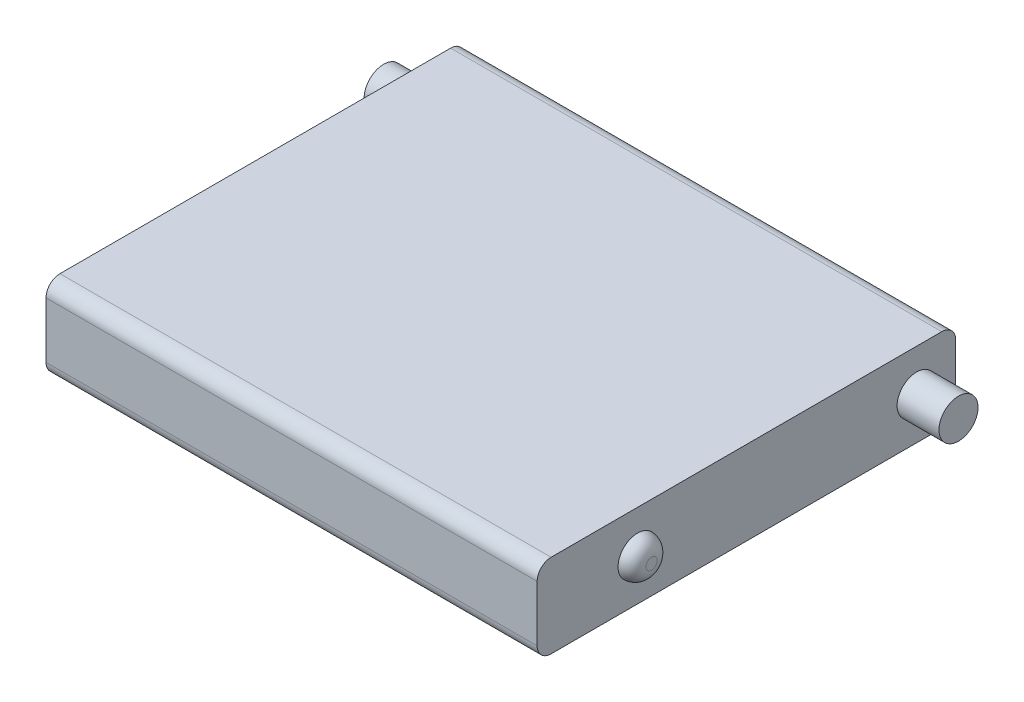
ISO-10303-21;
HEADER;
FILE_DESCRIPTION(('STEP AP214'),'2;1');
FILE_NAME('part.step','',(''),(''),'','','');
FILE_SCHEMA(('AUTOMOTIVE_DESIGN { 1 0 10303 214 1 1 1 1 }'));
ENDSEC;
DATA;
#1=APPLICATION_CONTEXT('core data for automotive mechanical design processes');
#2=APPLICATION_PROTOCOL_DEFINITION('international standard','automotive_design',2000,#1);
#3=PRODUCT_CONTEXT('',#1,'mechanical');
#4=PRODUCT('Part','Part','',(#3));
#5=PRODUCT_RELATED_PRODUCT_CATEGORY('part','',(#4));
#6=PRODUCT_DEFINITION_FORMATION('','',#4);
#7=PRODUCT_DEFINITION_CONTEXT('part definition',#1,'design');
#8=PRODUCT_DEFINITION('design','',#6,#7);
#9=PRODUCT_DEFINITION_SHAPE('','',#8);
#10=(LENGTH_UNIT() NAMED_UNIT(*) SI_UNIT(.MILLI.,.METRE.));
#11=(NAMED_UNIT(*) PLANE_ANGLE_UNIT() SI_UNIT($,.RADIAN.));
#12=(NAMED_UNIT(*) SI_UNIT($,.STERADIAN.) SOLID_ANGLE_UNIT());
#13=UNCERTAINTY_MEASURE_WITH_UNIT(LENGTH_MEASURE(1.E-05),#10,'distance_accuracy_value','');
#14=(GEOMETRIC_REPRESENTATION_CONTEXT(3) GLOBAL_UNCERTAINTY_ASSIGNED_CONTEXT((#13)) GLOBAL_UNIT_ASSIGNED_CONTEXT((#10,
#11,#12)) REPRESENTATION_CONTEXT('',''));
#15=CARTESIAN_POINT('',(0.,0.,0.));
#16=DIRECTION('',(0.,0.,1.));
#17=DIRECTION('',(1.,0.,0.));
#18=AXIS2_PLACEMENT_3D('',#15,#16,#17);
#19=CARTESIAN_POINT('',(8.80000000000001,1.5,-7.50000000000001));
#20=DIRECTION('',(-1.,0.,0.));
#21=DIRECTION('',(0.,0.,1.));
#22=AXIS2_PLACEMENT_3D('',#19,#20,#21);
#23=PLANE('',#22);
#24=CARTESIAN_POINT('',(8.8,0.,3.9));
#25=DIRECTION('',(-1.,0.,0.));
#26=DIRECTION('',(0.,0.,1.));
#27=AXIS2_PLACEMENT_3D('',#24,#25,#26);
#28=CIRCLE('',#27,0.700000000000002);
#29=CARTESIAN_POINT('',(8.8,0.,4.6));
#30=VERTEX_POINT('',#29);
#31=EDGE_CURVE('E485',#30,#30,#28,.T.);
#32=ORIENTED_EDGE('',*,*,#31,.T.);
#33=EDGE_LOOP('',(#32));
#34=FACE_BOUND('',#33,.T.);
#35=CARTESIAN_POINT('',(8.8,0.,-6.1));
#36=DIRECTION('',(-1.,0.,0.));
#37=DIRECTION('',(0.,0.,1.));
#38=AXIS2_PLACEMENT_3D('',#35,#36,#37);
#39=CIRCLE('',#38,0.700000000000002);
#40=CARTESIAN_POINT('',(8.8,0.,-5.4));
#41=VERTEX_POINT('',#40);
#42=EDGE_CURVE('E481',#41,#41,#39,.T.);
#43=ORIENTED_EDGE('',*,*,#42,.T.);
#44=EDGE_LOOP('',(#43));
#45=FACE_BOUND('',#44,.T.);
#46=DIRECTION('',(0.,0.,-1.));
#47=VECTOR('',#46,1.);
#48=CARTESIAN_POINT('',(8.80000000000001,-1.5,-7.50000000000001));
#49=LINE('',#48,#47);
#50=CARTESIAN_POINT('',(8.80000000000001,-1.5,6.99999999999999));
#51=VERTEX_POINT('',#50);
#52=CARTESIAN_POINT('',(8.80000000000001,-1.5,-7.00000000000001));
#53=VERTEX_POINT('',#52);
#54=EDGE_CURVE('E164',#51,#53,#49,.T.);
#55=ORIENTED_EDGE('',*,*,#54,.T.);
#56=CARTESIAN_POINT('',(8.80000000000001,-1.,-7.00000000000001));
#57=DIRECTION('',(-1.,0.,0.));
#58=DIRECTION('',(0.,0.,1.));
#59=AXIS2_PLACEMENT_3D('',#56,#57,#58);
#60=CIRCLE('',#59,0.5);
#61=CARTESIAN_POINT('',(8.80000000000001,-1.,-7.50000000000001));
#62=VERTEX_POINT('',#61);
#63=EDGE_CURVE('E223',#53,#62,#60,.F.);
#64=ORIENTED_EDGE('',*,*,#63,.T.);
#65=DIRECTION('',(0.,-1.,0.));
#66=VECTOR('',#65,1.);
#67=CARTESIAN_POINT('',(8.80000000000001,1.5,-7.50000000000001));
#68=LINE('',#67,#66);
#69=CARTESIAN_POINT('',(8.80000000000001,1.,-7.50000000000001));
#70=VERTEX_POINT('',#69);
#71=EDGE_CURVE('E187',#70,#62,#68,.T.);
#72=ORIENTED_EDGE('',*,*,#71,.F.);
#73=CARTESIAN_POINT('',(8.80000000000001,1.,-7.00000000000001));
#74=DIRECTION('',(-1.,0.,0.));
#75=DIRECTION('',(0.,0.,1.));
#76=AXIS2_PLACEMENT_3D('',#73,#74,#75);
#77=CIRCLE('',#76,0.5);
#78=CARTESIAN_POINT('',(8.80000000000001,1.5,-7.00000000000001));
#79=VERTEX_POINT('',#78);
#80=EDGE_CURVE('E221',#70,#79,#77,.F.);
#81=ORIENTED_EDGE('',*,*,#80,.T.);
#82=DIRECTION('',(0.,0.,-1.));
#83=VECTOR('',#82,1.);
#84=CARTESIAN_POINT('',(8.80000000000001,1.5,-7.50000000000001));
#85=LINE('',#84,#83);
#86=CARTESIAN_POINT('',(8.80000000000001,1.5,6.99999999999999));
#87=VERTEX_POINT('',#86);
#88=EDGE_CURVE('E168',#87,#79,#85,.T.);
#89=ORIENTED_EDGE('',*,*,#88,.F.);
#90=CARTESIAN_POINT('',(8.80000000000001,1.,6.99999999999999));
#91=DIRECTION('',(-1.,0.,0.));
#92=DIRECTION('',(0.,0.,1.));
#93=AXIS2_PLACEMENT_3D('',#90,#91,#92);
#94=CIRCLE('',#93,0.5);
#95=CARTESIAN_POINT('',(8.80000000000001,1.,7.49999999999999));
#96=VERTEX_POINT('',#95);
#97=EDGE_CURVE('E54',#87,#96,#94,.F.);
#98=ORIENTED_EDGE('',*,*,#97,.T.);
#99=DIRECTION('',(0.,-1.,0.));
#100=VECTOR('',#99,1.);
#101=CARTESIAN_POINT('',(8.80000000000001,1.5,7.49999999999999));
#102=LINE('',#101,#100);
#103=CARTESIAN_POINT('',(8.80000000000001,-1.,7.49999999999999));
#104=VERTEX_POINT('',#103);
#105=EDGE_CURVE('E175',#96,#104,#102,.T.);
#106=ORIENTED_EDGE('',*,*,#105,.T.);
#107=CARTESIAN_POINT('',(8.80000000000001,-1.,6.99999999999999));
#108=DIRECTION('',(-1.,0.,0.));
#109=DIRECTION('',(0.,0.,1.));
#110=AXIS2_PLACEMENT_3D('',#107,#108,#109);
#111=CIRCLE('',#110,0.5);
#112=EDGE_CURVE('E47',#104,#51,#111,.F.);
#113=ORIENTED_EDGE('',*,*,#112,.T.);
#114=EDGE_LOOP('',(#55,#64,#72,#81,#89,#98,#106,#113));
#115=FACE_BOUND('',#114,.T.);
#116=ADVANCED_FACE('F32',(#34,#45,#115),#23,.F.);
#117=CARTESIAN_POINT('',(-8.8,1.5,-7.50000000000001));
#118=DIRECTION('',(0.,0.,1.));
#119=DIRECTION('',(1.,0.,0.));
#120=AXIS2_PLACEMENT_3D('',#117,#118,#119);
#121=PLANE('',#120);
#122=ORIENTED_EDGE('',*,*,#71,.T.);
#123=DIRECTION('',(-1.,0.,0.));
#124=VECTOR('',#123,1.);
#125=CARTESIAN_POINT('',(-8.8,-1.,-7.50000000000001));
#126=LINE('',#125,#124);
#127=CARTESIAN_POINT('',(-8.8,-1.,-7.50000000000001));
#128=VERTEX_POINT('',#127);
#129=EDGE_CURVE('E204',#62,#128,#126,.T.);
#130=ORIENTED_EDGE('',*,*,#129,.T.);
#131=DIRECTION('',(0.,-1.,0.));
#132=VECTOR('',#131,1.);
#133=CARTESIAN_POINT('',(-8.8,1.5,-7.50000000000001));
#134=LINE('',#133,#132);
#135=CARTESIAN_POINT('',(-8.8,1.,-7.50000000000001));
#136=VERTEX_POINT('',#135);
#137=EDGE_CURVE('E184',#136,#128,#134,.T.);
#138=ORIENTED_EDGE('',*,*,#137,.F.);
#139=DIRECTION('',(-1.,0.,0.));
#140=VECTOR('',#139,1.);
#141=CARTESIAN_POINT('',(8.80000000000001,1.,-7.50000000000001));
#142=LINE('',#141,#140);
#143=EDGE_CURVE('E202',#136,#70,#142,.F.);
#144=ORIENTED_EDGE('',*,*,#143,.T.);
#145=EDGE_LOOP('',(#122,#130,#138,#144));
#146=FACE_BOUND('',#145,.T.);
#147=ADVANCED_FACE('F251',(#146),#121,.F.);
#148=CARTESIAN_POINT('',(-8.8,1.5,-7.50000000000001));
#149=DIRECTION('',(1.,0.,0.));
#150=DIRECTION('',(0.,0.,-1.));
#151=AXIS2_PLACEMENT_3D('',#148,#149,#150);
#152=PLANE('',#151);
#153=CARTESIAN_POINT('',(-8.8,0.,3.9));
#154=DIRECTION('',(1.,0.,0.));
#155=DIRECTION('',(0.,0.,-1.));
#156=AXIS2_PLACEMENT_3D('',#153,#154,#155);
#157=CIRCLE('',#156,0.700000000000002);
#158=CARTESIAN_POINT('',(-8.8,0.,3.2));
#159=VERTEX_POINT('',#158);
#160=EDGE_CURVE('E193',#159,#159,#157,.F.);
#161=ORIENTED_EDGE('',*,*,#160,.F.);
#162=EDGE_LOOP('',(#161));
#163=FACE_BOUND('',#162,.T.);
#164=CARTESIAN_POINT('',(-8.8,0.,-6.1));
#165=DIRECTION('',(1.,0.,0.));
#166=DIRECTION('',(0.,0.,-1.));
#167=AXIS2_PLACEMENT_3D('',#164,#165,#166);
#168=CIRCLE('',#167,0.700000000000002);
#169=CARTESIAN_POINT('',(-8.8,0.,-6.8));
#170=VERTEX_POINT('',#169);
#171=EDGE_CURVE('E190',#170,#170,#168,.F.);
#172=ORIENTED_EDGE('',*,*,#171,.F.);
#173=EDGE_LOOP('',(#172));
#174=FACE_BOUND('',#173,.T.);
#175=ORIENTED_EDGE('',*,*,#137,.T.);
#176=CARTESIAN_POINT('',(-8.8,-1.,-7.00000000000001));
#177=DIRECTION('',(1.,0.,0.));
#178=DIRECTION('',(0.,0.,-1.));
#179=AXIS2_PLACEMENT_3D('',#176,#177,#178);
#180=CIRCLE('',#179,0.5);
#181=CARTESIAN_POINT('',(-8.8,-1.5,-7.00000000000001));
#182=VERTEX_POINT('',#181);
#183=EDGE_CURVE('E213',#128,#182,#180,.F.);
#184=ORIENTED_EDGE('',*,*,#183,.T.);
#185=DIRECTION('',(0.,0.,1.));
#186=VECTOR('',#185,1.);
#187=CARTESIAN_POINT('',(-8.8,-1.5,-7.50000000000001));
#188=LINE('',#187,#186);
#189=CARTESIAN_POINT('',(-8.8,-1.5,6.99999999999999));
#190=VERTEX_POINT('',#189);
#191=EDGE_CURVE('E172',#182,#190,#188,.T.);
#192=ORIENTED_EDGE('',*,*,#191,.T.);
#193=CARTESIAN_POINT('',(-8.8,-1.,6.99999999999999));
#194=DIRECTION('',(1.,0.,0.));
#195=DIRECTION('',(0.,0.,-1.));
#196=AXIS2_PLACEMENT_3D('',#193,#194,#195);
#197=CIRCLE('',#196,0.5);
#198=CARTESIAN_POINT('',(-8.8,-1.,7.49999999999999));
#199=VERTEX_POINT('',#198);
#200=EDGE_CURVE('E209',#190,#199,#197,.F.);
#201=ORIENTED_EDGE('',*,*,#200,.T.);
#202=DIRECTION('',(0.,-1.,0.));
#203=VECTOR('',#202,1.);
#204=CARTESIAN_POINT('',(-8.8,1.5,7.49999999999999));
#205=LINE('',#204,#203);
#206=CARTESIAN_POINT('',(-8.8,1.,7.49999999999999));
#207=VERTEX_POINT('',#206);
#208=EDGE_CURVE('E181',#207,#199,#205,.T.);
#209=ORIENTED_EDGE('',*,*,#208,.F.);
#210=CARTESIAN_POINT('',(-8.8,1.,6.99999999999999));
#211=DIRECTION('',(1.,0.,0.));
#212=DIRECTION('',(0.,0.,-1.));
#213=AXIS2_PLACEMENT_3D('',#210,#211,#212);
#214=CIRCLE('',#213,0.5);
#215=CARTESIAN_POINT('',(-8.8,1.5,6.99999999999999));
#216=VERTEX_POINT('',#215);
#217=EDGE_CURVE('E207',#207,#216,#214,.F.);
#218=ORIENTED_EDGE('',*,*,#217,.T.);
#219=DIRECTION('',(0.,0.,1.));
#220=VECTOR('',#219,1.);
#221=CARTESIAN_POINT('',(-8.8,1.5,-7.50000000000001));
#222=LINE('',#221,#220);
#223=CARTESIAN_POINT('',(-8.8,1.5,-7.00000000000001));
#224=VERTEX_POINT('',#223);
#225=EDGE_CURVE('E171',#224,#216,#222,.T.);
#226=ORIENTED_EDGE('',*,*,#225,.F.);
#227=CARTESIAN_POINT('',(-8.8,1.,-7.00000000000001));
#228=DIRECTION('',(1.,0.,0.));
#229=DIRECTION('',(0.,0.,-1.));
#230=AXIS2_PLACEMENT_3D('',#227,#228,#229);
#231=CIRCLE('',#230,0.5);
#232=EDGE_CURVE('E211',#224,#136,#231,.F.);
#233=ORIENTED_EDGE('',*,*,#232,.T.);
#234=EDGE_LOOP('',(#175,#184,#192,#201,#209,#218,#226,#233));
#235=FACE_BOUND('',#234,.T.);
#236=ADVANCED_FACE('F237',(#163,#174,#235),#152,.F.);
#237=CARTESIAN_POINT('',(-8.8,1.5,7.49999999999999));
#238=DIRECTION('',(0.,0.,-1.));
#239=DIRECTION('',(-1.,0.,0.));
#240=AXIS2_PLACEMENT_3D('',#237,#238,#239);
#241=PLANE('',#240);
#242=ORIENTED_EDGE('',*,*,#208,.T.);
#243=DIRECTION('',(1.,0.,0.));
#244=VECTOR('',#243,1.);
#245=CARTESIAN_POINT('',(-8.8,-1.,7.49999999999999));
#246=LINE('',#245,#244);
#247=EDGE_CURVE('E11',#199,#104,#246,.T.);
#248=ORIENTED_EDGE('',*,*,#247,.T.);
#249=ORIENTED_EDGE('',*,*,#105,.F.);
#250=DIRECTION('',(1.,0.,0.));
#251=VECTOR('',#250,1.);
#252=CARTESIAN_POINT('',(-8.8,1.,7.49999999999999));
#253=LINE('',#252,#251);
#254=EDGE_CURVE('E40',#96,#207,#253,.F.);
#255=ORIENTED_EDGE('',*,*,#254,.T.);
#256=EDGE_LOOP('',(#242,#248,#249,#255));
#257=FACE_BOUND('',#256,.T.);
#258=ADVANCED_FACE('F233',(#257),#241,.F.);
#259=CARTESIAN_POINT('',(0.,1.5,0.));
#260=DIRECTION('',(0.,1.,0.));
#261=DIRECTION('',(0.,0.,1.));
#262=AXIS2_PLACEMENT_3D('',#259,#260,#261);
#263=PLANE('',#262);
#264=ORIENTED_EDGE('',*,*,#88,.T.);
#265=DIRECTION('',(-1.,0.,0.));
#266=VECTOR('',#265,1.);
#267=CARTESIAN_POINT('',(-8.8,1.5,-7.00000000000001));
#268=LINE('',#267,#266);
#269=EDGE_CURVE('E228',#79,#224,#268,.T.);
#270=ORIENTED_EDGE('',*,*,#269,.T.);
#271=ORIENTED_EDGE('',*,*,#225,.T.);
#272=DIRECTION('',(1.,0.,0.));
#273=VECTOR('',#272,1.);
#274=CARTESIAN_POINT('',(8.80000000000001,1.5,6.99999999999999));
#275=LINE('',#274,#273);
#276=EDGE_CURVE('E225',#216,#87,#275,.T.);
#277=ORIENTED_EDGE('',*,*,#276,.T.);
#278=EDGE_LOOP('',(#264,#270,#271,#277));
#279=FACE_BOUND('',#278,.T.);
#280=ADVANCED_FACE('F242',(#279),#263,.T.);
#281=CARTESIAN_POINT('',(0.,-1.5,0.));
#282=DIRECTION('',(0.,1.,0.));
#283=DIRECTION('',(0.,0.,1.));
#284=AXIS2_PLACEMENT_3D('',#281,#282,#283);
#285=PLANE('',#284);
#286=DIRECTION('',(-1.,0.,0.));
#287=VECTOR('',#286,1.);
#288=CARTESIAN_POINT('',(-7.4,-1.5,4.99999999999999));
#289=LINE('',#288,#287);
#290=CARTESIAN_POINT('',(7.40000000000001,-1.5,4.99999999999999));
#291=VERTEX_POINT('',#290);
#292=CARTESIAN_POINT('',(-7.4,-1.5,4.99999999999999));
#293=VERTEX_POINT('',#292);
#294=EDGE_CURVE('E158',#291,#293,#289,.T.);
#295=ORIENTED_EDGE('',*,*,#294,.F.);
#296=DIRECTION('',(0.,0.,1.));
#297=VECTOR('',#296,1.);
#298=CARTESIAN_POINT('',(7.40000000000001,-1.5,4.99999999999999));
#299=LINE('',#298,#297);
#300=CARTESIAN_POINT('',(7.40000000000001,-1.5,-4.99999999999999));
#301=VERTEX_POINT('',#300);
#302=EDGE_CURVE('E129',#301,#291,#299,.T.);
#303=ORIENTED_EDGE('',*,*,#302,.F.);
#304=DIRECTION('',(1.,0.,0.));
#305=VECTOR('',#304,1.);
#306=CARTESIAN_POINT('',(-7.4,-1.5,-4.99999999999999));
#307=LINE('',#306,#305);
#308=CARTESIAN_POINT('',(-7.4,-1.5,-4.99999999999999));
#309=VERTEX_POINT('',#308);
#310=EDGE_CURVE('E146',#309,#301,#307,.T.);
#311=ORIENTED_EDGE('',*,*,#310,.F.);
#312=DIRECTION('',(0.,0.,-1.));
#313=VECTOR('',#312,1.);
#314=CARTESIAN_POINT('',(-7.4,-1.5,4.99999999999999));
#315=LINE('',#314,#313);
#316=EDGE_CURVE('E149',#293,#309,#315,.T.);
#317=ORIENTED_EDGE('',*,*,#316,.F.);
#318=EDGE_LOOP('',(#295,#303,#311,#317));
#319=FACE_BOUND('',#318,.T.);
#320=ORIENTED_EDGE('',*,*,#191,.F.);
#321=DIRECTION('',(-1.,0.,0.));
#322=VECTOR('',#321,1.);
#323=CARTESIAN_POINT('',(0.,-1.5,-7.00000000000001));
#324=LINE('',#323,#322);
#325=EDGE_CURVE('E217',#182,#53,#324,.F.);
#326=ORIENTED_EDGE('',*,*,#325,.T.);
#327=ORIENTED_EDGE('',*,*,#54,.F.);
#328=DIRECTION('',(1.,0.,0.));
#329=VECTOR('',#328,1.);
#330=CARTESIAN_POINT('',(0.,-1.5,6.99999999999999));
#331=LINE('',#330,#329);
#332=EDGE_CURVE('E215',#51,#190,#331,.F.);
#333=ORIENTED_EDGE('',*,*,#332,.T.);
#334=EDGE_LOOP('',(#320,#326,#327,#333));
#335=FACE_BOUND('',#334,.T.);
#336=ADVANCED_FACE('F259',(#319,#335),#285,.F.);
#337=CARTESIAN_POINT('',(7.40000000000001,-0.1,4.99999999999999));
#338=DIRECTION('',(1.,0.,0.));
#339=DIRECTION('',(0.,0.,-1.));
#340=AXIS2_PLACEMENT_3D('',#337,#338,#339);
#341=PLANE('',#340);
#342=ORIENTED_EDGE('',*,*,#302,.T.);
#343=DIRECTION('',(0.,-1.,0.));
#344=VECTOR('',#343,1.);
#345=CARTESIAN_POINT('',(7.40000000000001,-0.1,4.99999999999999));
#346=LINE('',#345,#344);
#347=CARTESIAN_POINT('',(7.40000000000001,-0.1,4.99999999999999));
#348=VERTEX_POINT('',#347);
#349=EDGE_CURVE('E122',#348,#291,#346,.T.);
#350=ORIENTED_EDGE('',*,*,#349,.F.);
#351=DIRECTION('',(0.,0.,1.));
#352=VECTOR('',#351,1.);
#353=CARTESIAN_POINT('',(7.40000000000001,-0.1,4.99999999999999));
#354=LINE('',#353,#352);
#355=CARTESIAN_POINT('',(7.40000000000001,-0.1,-4.99999999999999));
#356=VERTEX_POINT('',#355);
#357=EDGE_CURVE('E126',#356,#348,#354,.T.);
#358=ORIENTED_EDGE('',*,*,#357,.F.);
#359=DIRECTION('',(0.,-1.,0.));
#360=VECTOR('',#359,1.);
#361=CARTESIAN_POINT('',(7.40000000000001,-0.1,-4.99999999999999));
#362=LINE('',#361,#360);
#363=EDGE_CURVE('E162',#356,#301,#362,.T.);
#364=ORIENTED_EDGE('',*,*,#363,.T.);
#365=EDGE_LOOP('',(#342,#350,#358,#364));
#366=FACE_BOUND('',#365,.T.);
#367=ADVANCED_FACE('F124',(#366),#341,.F.);
#368=CARTESIAN_POINT('',(-7.4,-0.1,-4.99999999999999));
#369=DIRECTION('',(0.,0.,-1.));
#370=DIRECTION('',(-1.,0.,0.));
#371=AXIS2_PLACEMENT_3D('',#368,#369,#370);
#372=PLANE('',#371);
#373=ORIENTED_EDGE('',*,*,#310,.T.);
#374=ORIENTED_EDGE('',*,*,#363,.F.);
#375=DIRECTION('',(1.,0.,0.));
#376=VECTOR('',#375,1.);
#377=CARTESIAN_POINT('',(-7.4,-0.1,-4.99999999999999));
#378=LINE('',#377,#376);
#379=CARTESIAN_POINT('',(-7.4,-0.1,-4.99999999999999));
#380=VERTEX_POINT('',#379);
#381=EDGE_CURVE('E134',#380,#356,#378,.T.);
#382=ORIENTED_EDGE('',*,*,#381,.F.);
#383=DIRECTION('',(0.,-1.,0.));
#384=VECTOR('',#383,1.);
#385=CARTESIAN_POINT('',(-7.4,-0.1,-4.99999999999999));
#386=LINE('',#385,#384);
#387=EDGE_CURVE('E165',#380,#309,#386,.T.);
#388=ORIENTED_EDGE('',*,*,#387,.T.);
#389=EDGE_LOOP('',(#373,#374,#382,#388));
#390=FACE_BOUND('',#389,.T.);
#391=ADVANCED_FACE('F397',(#390),#372,.F.);
#392=CARTESIAN_POINT('',(-7.4,-0.1,4.99999999999999));
#393=DIRECTION('',(-1.,0.,0.));
#394=DIRECTION('',(0.,0.,1.));
#395=AXIS2_PLACEMENT_3D('',#392,#393,#394);
#396=PLANE('',#395);
#397=ORIENTED_EDGE('',*,*,#316,.T.);
#398=ORIENTED_EDGE('',*,*,#387,.F.);
#399=DIRECTION('',(0.,0.,-1.));
#400=VECTOR('',#399,1.);
#401=CARTESIAN_POINT('',(-7.4,-0.1,4.99999999999999));
#402=LINE('',#401,#400);
#403=CARTESIAN_POINT('',(-7.4,-0.1,4.99999999999999));
#404=VERTEX_POINT('',#403);
#405=EDGE_CURVE('E142',#404,#380,#402,.T.);
#406=ORIENTED_EDGE('',*,*,#405,.F.);
#407=DIRECTION('',(0.,-1.,0.));
#408=VECTOR('',#407,1.);
#409=CARTESIAN_POINT('',(-7.4,-0.1,4.99999999999999));
#410=LINE('',#409,#408);
#411=EDGE_CURVE('E133',#404,#293,#410,.T.);
#412=ORIENTED_EDGE('',*,*,#411,.T.);
#413=EDGE_LOOP('',(#397,#398,#406,#412));
#414=FACE_BOUND('',#413,.T.);
#415=ADVANCED_FACE('F389',(#414),#396,.F.);
#416=CARTESIAN_POINT('',(-7.4,-0.1,4.99999999999999));
#417=DIRECTION('',(0.,0.,1.));
#418=DIRECTION('',(1.,0.,0.));
#419=AXIS2_PLACEMENT_3D('',#416,#417,#418);
#420=PLANE('',#419);
#421=ORIENTED_EDGE('',*,*,#294,.T.);
#422=ORIENTED_EDGE('',*,*,#411,.F.);
#423=DIRECTION('',(-1.,0.,0.));
#424=VECTOR('',#423,1.);
#425=CARTESIAN_POINT('',(-7.4,-0.1,4.99999999999999));
#426=LINE('',#425,#424);
#427=EDGE_CURVE('E137',#348,#404,#426,.T.);
#428=ORIENTED_EDGE('',*,*,#427,.F.);
#429=ORIENTED_EDGE('',*,*,#349,.T.);
#430=EDGE_LOOP('',(#421,#422,#428,#429));
#431=FACE_BOUND('',#430,.T.);
#432=ADVANCED_FACE('F138',(#431),#420,.F.);
#433=CARTESIAN_POINT('',(0.,-0.1,0.));
#434=DIRECTION('',(0.,-1.,0.));
#435=DIRECTION('',(0.,0.,-1.));
#436=AXIS2_PLACEMENT_3D('',#433,#434,#435);
#437=PLANE('',#436);
#438=ORIENTED_EDGE('',*,*,#357,.T.);
#439=ORIENTED_EDGE('',*,*,#427,.T.);
#440=ORIENTED_EDGE('',*,*,#405,.T.);
#441=ORIENTED_EDGE('',*,*,#381,.T.);
#442=EDGE_LOOP('',(#438,#439,#440,#441));
#443=FACE_BOUND('',#442,.T.);
#444=ADVANCED_FACE('F144',(#443),#437,.T.);
#445=CARTESIAN_POINT('',(-10.3,0.,-6.1));
#446=DIRECTION('',(1.,0.,0.));
#447=DIRECTION('',(0.,0.,-1.));
#448=AXIS2_PLACEMENT_3D('',#445,#446,#447);
#449=CYLINDRICAL_SURFACE('',#448,0.700000000000002);
#450=CARTESIAN_POINT('',(-10.3,0.,-6.1));
#451=DIRECTION('',(-1.,0.,0.));
#452=DIRECTION('',(0.,0.,1.));
#453=AXIS2_PLACEMENT_3D('',#450,#451,#452);
#454=CIRCLE('',#453,0.700000000000002);
#455=CARTESIAN_POINT('',(-10.3,0.,-5.4));
#456=VERTEX_POINT('',#455);
#457=EDGE_CURVE('E152',#456,#456,#454,.T.);
#458=ORIENTED_EDGE('',*,*,#457,.F.);
#459=EDGE_LOOP('',(#458));
#460=FACE_BOUND('',#459,.T.);
#461=ORIENTED_EDGE('',*,*,#171,.T.);
#462=EDGE_LOOP('',(#461));
#463=FACE_BOUND('',#462,.T.);
#464=ADVANCED_FACE('F365',(#460,#463),#449,.T.);
#465=CARTESIAN_POINT('',(-10.3,0.,-6.1));
#466=DIRECTION('',(-1.,0.,0.));
#467=DIRECTION('',(0.,0.,1.));
#468=AXIS2_PLACEMENT_3D('',#465,#466,#467);
#469=PLANE('',#468);
#470=ORIENTED_EDGE('',*,*,#457,.T.);
#471=EDGE_LOOP('',(#470));
#472=FACE_BOUND('',#471,.T.);
#473=ADVANCED_FACE('F356',(#472),#469,.T.);
#474=CARTESIAN_POINT('',(-9.3,0.,3.9));
#475=DIRECTION('',(-1.,0.,0.));
#476=DIRECTION('',(0.,0.,1.));
#477=AXIS2_PLACEMENT_3D('',#474,#475,#476);
#478=PLANE('',#477);
#479=CARTESIAN_POINT('',(-9.3,0.,3.9));
#480=DIRECTION('',(-1.,0.,0.));
#481=DIRECTION('',(0.,0.,1.));
#482=AXIS2_PLACEMENT_3D('',#479,#480,#481);
#483=CIRCLE('',#482,0.200000000000002);
#484=CARTESIAN_POINT('',(-9.3,0.,4.1));
#485=VERTEX_POINT('',#484);
#486=EDGE_CURVE('E196',#485,#485,#483,.T.);
#487=ORIENTED_EDGE('',*,*,#486,.T.);
#488=EDGE_LOOP('',(#487));
#489=FACE_BOUND('',#488,.T.);
#490=ADVANCED_FACE('F283',(#489),#478,.T.);
#491=CARTESIAN_POINT('',(-8.8,0.,3.9));
#492=DIRECTION('',(-1.,0.,0.));
#493=DIRECTION('',(0.,0.,1.));
#494=AXIS2_PLACEMENT_3D('',#491,#492,#493);
#495=DEGENERATE_TOROIDAL_SURFACE('',#494,0.200000000000002,0.5,.T.);
#496=ORIENTED_EDGE('',*,*,#160,.T.);
#497=EDGE_LOOP('',(#496));
#498=FACE_BOUND('',#497,.T.);
#499=ORIENTED_EDGE('',*,*,#486,.F.);
#500=EDGE_LOOP('',(#499));
#501=FACE_BOUND('',#500,.T.);
#502=ADVANCED_FACE('F279',(#498,#501),#495,.T.);
#503=CARTESIAN_POINT('',(10.3,0.,-6.1));
#504=DIRECTION('',(-1.,0.,0.));
#505=DIRECTION('',(0.,0.,1.));
#506=AXIS2_PLACEMENT_3D('',#503,#504,#505);
#507=CYLINDRICAL_SURFACE('',#506,0.700000000000002);
#508=CARTESIAN_POINT('',(10.3,0.,-6.1));
#509=DIRECTION('',(-1.,0.,0.));
#510=DIRECTION('',(0.,0.,1.));
#511=AXIS2_PLACEMENT_3D('',#508,#509,#510);
#512=CIRCLE('',#511,0.700000000000002);
#513=CARTESIAN_POINT('',(10.3,0.,-5.4));
#514=VERTEX_POINT('',#513);
#515=EDGE_CURVE('E479',#514,#514,#512,.T.);
#516=ORIENTED_EDGE('',*,*,#515,.T.);
#517=EDGE_LOOP('',(#516));
#518=FACE_BOUND('',#517,.T.);
#519=ORIENTED_EDGE('',*,*,#42,.F.);
#520=EDGE_LOOP('',(#519));
#521=FACE_BOUND('',#520,.T.);
#522=ADVANCED_FACE('F282',(#518,#521),#507,.T.);
#523=CARTESIAN_POINT('',(10.3,0.,-6.1));
#524=DIRECTION('',(1.,0.,0.));
#525=DIRECTION('',(0.,0.,1.));
#526=AXIS2_PLACEMENT_3D('',#523,#524,#525);
#527=PLANE('',#526);
#528=ORIENTED_EDGE('',*,*,#515,.F.);
#529=EDGE_LOOP('',(#528));
#530=FACE_BOUND('',#529,.T.);
#531=ADVANCED_FACE('F326',(#530),#527,.T.);
#532=CARTESIAN_POINT('',(9.3,0.,3.9));
#533=DIRECTION('',(1.,0.,0.));
#534=DIRECTION('',(0.,0.,1.));
#535=AXIS2_PLACEMENT_3D('',#532,#533,#534);
#536=PLANE('',#535);
#537=CARTESIAN_POINT('',(9.3,0.,3.9));
#538=DIRECTION('',(1.,0.,0.));
#539=DIRECTION('',(0.,0.,-1.));
#540=AXIS2_PLACEMENT_3D('',#537,#538,#539);
#541=CIRCLE('',#540,0.200000000000002);
#542=CARTESIAN_POINT('',(9.3,0.,3.7));
#543=VERTEX_POINT('',#542);
#544=EDGE_CURVE('E199',#543,#543,#541,.T.);
#545=ORIENTED_EDGE('',*,*,#544,.T.);
#546=EDGE_LOOP('',(#545));
#547=FACE_BOUND('',#546,.T.);
#548=ADVANCED_FACE('F288',(#547),#536,.T.);
#549=CARTESIAN_POINT('',(8.8,0.,3.9));
#550=DIRECTION('',(1.,0.,0.));
#551=DIRECTION('',(0.,0.,-1.));
#552=AXIS2_PLACEMENT_3D('',#549,#550,#551);
#553=DEGENERATE_TOROIDAL_SURFACE('',#552,0.200000000000002,0.5,.T.);
#554=ORIENTED_EDGE('',*,*,#544,.F.);
#555=EDGE_LOOP('',(#554));
#556=FACE_BOUND('',#555,.T.);
#557=ORIENTED_EDGE('',*,*,#31,.F.);
#558=EDGE_LOOP('',(#557));
#559=FACE_BOUND('',#558,.T.);
#560=ADVANCED_FACE('F285',(#556,#559),#553,.T.);
#561=CARTESIAN_POINT('',(-8.8,-1.,-7.00000000000001));
#562=DIRECTION('',(-1.,0.,0.));
#563=DIRECTION('',(0.,0.,1.));
#564=AXIS2_PLACEMENT_3D('',#561,#562,#563);
#565=CYLINDRICAL_SURFACE('',#564,0.5);
#566=ORIENTED_EDGE('',*,*,#63,.F.);
#567=ORIENTED_EDGE('',*,*,#325,.F.);
#568=ORIENTED_EDGE('',*,*,#183,.F.);
#569=ORIENTED_EDGE('',*,*,#129,.F.);
#570=EDGE_LOOP('',(#566,#567,#568,#569));
#571=FACE_BOUND('',#570,.T.);
#572=ADVANCED_FACE('F255',(#571),#565,.T.);
#573=CARTESIAN_POINT('',(0.,1.,-7.00000000000001));
#574=DIRECTION('',(1.,0.,0.));
#575=DIRECTION('',(0.,0.,-1.));
#576=AXIS2_PLACEMENT_3D('',#573,#574,#575);
#577=CYLINDRICAL_SURFACE('',#576,0.5);
#578=ORIENTED_EDGE('',*,*,#80,.F.);
#579=ORIENTED_EDGE('',*,*,#143,.F.);
#580=ORIENTED_EDGE('',*,*,#232,.F.);
#581=ORIENTED_EDGE('',*,*,#269,.F.);
#582=EDGE_LOOP('',(#578,#579,#580,#581));
#583=FACE_BOUND('',#582,.T.);
#584=ADVANCED_FACE('F248',(#583),#577,.T.);
#585=CARTESIAN_POINT('',(-8.8,-1.,6.99999999999999));
#586=DIRECTION('',(1.,0.,0.));
#587=DIRECTION('',(0.,0.,-1.));
#588=AXIS2_PLACEMENT_3D('',#585,#586,#587);
#589=CYLINDRICAL_SURFACE('',#588,0.5);
#590=ORIENTED_EDGE('',*,*,#200,.F.);
#591=ORIENTED_EDGE('',*,*,#332,.F.);
#592=ORIENTED_EDGE('',*,*,#112,.F.);
#593=ORIENTED_EDGE('',*,*,#247,.F.);
#594=EDGE_LOOP('',(#590,#591,#592,#593));
#595=FACE_BOUND('',#594,.T.);
#596=ADVANCED_FACE('F261',(#595),#589,.T.);
#597=CARTESIAN_POINT('',(0.,1.,6.99999999999999));
#598=DIRECTION('',(-1.,0.,0.));
#599=DIRECTION('',(0.,0.,1.));
#600=AXIS2_PLACEMENT_3D('',#597,#598,#599);
#601=CYLINDRICAL_SURFACE('',#600,0.5);
#602=ORIENTED_EDGE('',*,*,#217,.F.);
#603=ORIENTED_EDGE('',*,*,#254,.F.);
#604=ORIENTED_EDGE('',*,*,#97,.F.);
#605=ORIENTED_EDGE('',*,*,#276,.F.);
#606=EDGE_LOOP('',(#602,#603,#604,#605));
#607=FACE_BOUND('',#606,.T.);
#608=ADVANCED_FACE('F34',(#607),#601,.T.);
#609=CLOSED_SHELL('',(#116,#147,#236,#258,#280,#336,#367,#391,#415,#432,#444,#464,#473,#490,
#502,#522,#531,#548,#560,#572,#584,#596,#608));
#610=MANIFOLD_SOLID_BREP('B2',#609);
#611=ADVANCED_BREP_SHAPE_REPRESENTATION('',(#18,#610),#14);
#612=SHAPE_DEFINITION_REPRESENTATION(#9,#611);
ENDSEC;
END-ISO-10303-21;
